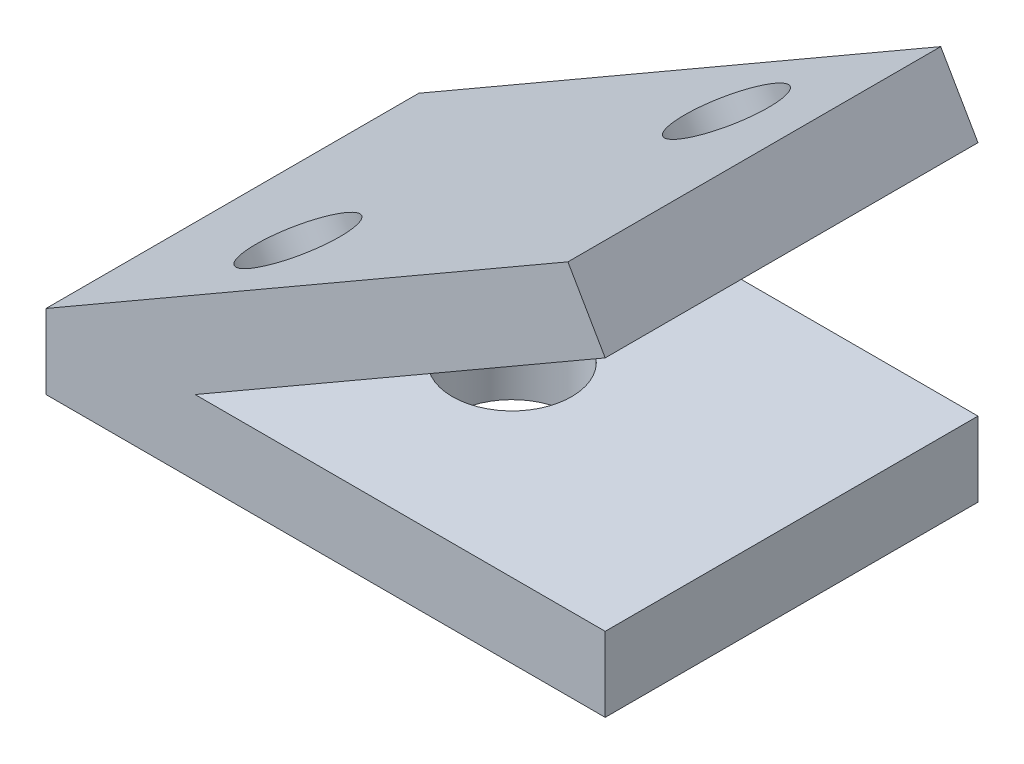
ISO-10303-21;
HEADER;
FILE_DESCRIPTION(('STEP AP214'),'2;1');
FILE_NAME('part.step','',(''),(''),'','','');
FILE_SCHEMA(('AUTOMOTIVE_DESIGN { 1 0 10303 214 1 1 1 1 }'));
ENDSEC;
DATA;
#1=APPLICATION_CONTEXT('core data for automotive mechanical design processes');
#2=APPLICATION_PROTOCOL_DEFINITION('international standard','automotive_design',2000,#1);
#3=PRODUCT_CONTEXT('',#1,'mechanical');
#4=PRODUCT('Part','Part','',(#3));
#5=PRODUCT_RELATED_PRODUCT_CATEGORY('part','',(#4));
#6=PRODUCT_DEFINITION_FORMATION('','',#4);
#7=PRODUCT_DEFINITION_CONTEXT('part definition',#1,'design');
#8=PRODUCT_DEFINITION('design','',#6,#7);
#9=PRODUCT_DEFINITION_SHAPE('','',#8);
#10=(LENGTH_UNIT() NAMED_UNIT(*) SI_UNIT(.MILLI.,.METRE.));
#11=(NAMED_UNIT(*) PLANE_ANGLE_UNIT() SI_UNIT($,.RADIAN.));
#12=(NAMED_UNIT(*) SI_UNIT($,.STERADIAN.) SOLID_ANGLE_UNIT());
#13=UNCERTAINTY_MEASURE_WITH_UNIT(LENGTH_MEASURE(1.E-05),#10,'distance_accuracy_value','');
#14=(GEOMETRIC_REPRESENTATION_CONTEXT(3) GLOBAL_UNCERTAINTY_ASSIGNED_CONTEXT((#13)) GLOBAL_UNIT_ASSIGNED_CONTEXT((#10,
#11,#12)) REPRESENTATION_CONTEXT('',''));
#15=CARTESIAN_POINT('',(0.,0.,0.));
#16=DIRECTION('',(0.,0.,1.));
#17=DIRECTION('',(1.,0.,0.));
#18=AXIS2_PLACEMENT_3D('',#15,#16,#17);
#19=CARTESIAN_POINT('',(0.,0.,10.));
#20=DIRECTION('',(1.,0.,0.));
#21=DIRECTION('',(0.,0.,-1.));
#22=AXIS2_PLACEMENT_3D('',#19,#20,#21);
#23=PLANE('',#22);
#24=DIRECTION('',(0.,-1.,0.));
#25=VECTOR('',#24,1.);
#26=CARTESIAN_POINT('',(0.,0.,0.));
#27=LINE('',#26,#25);
#28=CARTESIAN_POINT('',(0.,2.,0.));
#29=VERTEX_POINT('',#28);
#30=CARTESIAN_POINT('',(0.,0.,0.));
#31=VERTEX_POINT('',#30);
#32=EDGE_CURVE('E153',#29,#31,#27,.T.);
#33=ORIENTED_EDGE('',*,*,#32,.T.);
#34=DIRECTION('',(0.,0.,-1.));
#35=VECTOR('',#34,1.);
#36=CARTESIAN_POINT('',(0.,0.,10.));
#37=LINE('',#36,#35);
#38=CARTESIAN_POINT('',(0.,0.,10.));
#39=VERTEX_POINT('',#38);
#40=EDGE_CURVE('E11',#39,#31,#37,.T.);
#41=ORIENTED_EDGE('',*,*,#40,.F.);
#42=DIRECTION('',(0.,-1.,0.));
#43=VECTOR('',#42,1.);
#44=CARTESIAN_POINT('',(0.,0.,10.));
#45=LINE('',#44,#43);
#46=CARTESIAN_POINT('',(0.,2.,10.));
#47=VERTEX_POINT('',#46);
#48=EDGE_CURVE('E135',#47,#39,#45,.T.);
#49=ORIENTED_EDGE('',*,*,#48,.F.);
#50=DIRECTION('',(0.,0.,-1.));
#51=VECTOR('',#50,1.);
#52=CARTESIAN_POINT('',(0.,2.,10.));
#53=LINE('',#52,#51);
#54=EDGE_CURVE('E144',#47,#29,#53,.T.);
#55=ORIENTED_EDGE('',*,*,#54,.T.);
#56=EDGE_LOOP('',(#33,#41,#49,#55));
#57=FACE_BOUND('',#56,.T.);
#58=ADVANCED_FACE('F44',(#57),#23,.F.);
#59=CARTESIAN_POINT('',(0.,0.,10.));
#60=DIRECTION('',(0.,1.,0.));
#61=DIRECTION('',(0.,0.,1.));
#62=AXIS2_PLACEMENT_3D('',#59,#60,#61);
#63=PLANE('',#62);
#64=CARTESIAN_POINT('',(7.5,0.,5.));
#65=DIRECTION('',(0.,1.,0.));
#66=DIRECTION('',(0.,0.,1.));
#67=AXIS2_PLACEMENT_3D('',#64,#65,#66);
#68=CIRCLE('',#67,1.6);
#69=CARTESIAN_POINT('',(7.5,0.,6.6));
#70=VERTEX_POINT('',#69);
#71=EDGE_CURVE('E197',#70,#70,#68,.F.);
#72=ORIENTED_EDGE('',*,*,#71,.F.);
#73=EDGE_LOOP('',(#72));
#74=FACE_BOUND('',#73,.T.);
#75=DIRECTION('',(1.,0.,0.));
#76=VECTOR('',#75,1.);
#77=CARTESIAN_POINT('',(0.,0.,0.));
#78=LINE('',#77,#76);
#79=CARTESIAN_POINT('',(15.,0.,0.));
#80=VERTEX_POINT('',#79);
#81=EDGE_CURVE('E140',#31,#80,#78,.T.);
#82=ORIENTED_EDGE('',*,*,#81,.T.);
#83=DIRECTION('',(0.,0.,-1.));
#84=VECTOR('',#83,1.);
#85=CARTESIAN_POINT('',(15.,0.,10.));
#86=LINE('',#85,#84);
#87=CARTESIAN_POINT('',(15.,0.,10.));
#88=VERTEX_POINT('',#87);
#89=EDGE_CURVE('E52',#88,#80,#86,.T.);
#90=ORIENTED_EDGE('',*,*,#89,.F.);
#91=DIRECTION('',(1.,0.,0.));
#92=VECTOR('',#91,1.);
#93=CARTESIAN_POINT('',(0.,0.,10.));
#94=LINE('',#93,#92);
#95=EDGE_CURVE('E90',#39,#88,#94,.T.);
#96=ORIENTED_EDGE('',*,*,#95,.F.);
#97=ORIENTED_EDGE('',*,*,#40,.T.);
#98=EDGE_LOOP('',(#82,#90,#96,#97));
#99=FACE_BOUND('',#98,.T.);
#100=ADVANCED_FACE('F156',(#74,#99),#63,.F.);
#101=CARTESIAN_POINT('',(15.,0.,10.));
#102=DIRECTION('',(-1.,0.,0.));
#103=DIRECTION('',(0.,0.,1.));
#104=AXIS2_PLACEMENT_3D('',#101,#102,#103);
#105=PLANE('',#104);
#106=DIRECTION('',(0.,1.,0.));
#107=VECTOR('',#106,1.);
#108=CARTESIAN_POINT('',(15.,0.,0.));
#109=LINE('',#108,#107);
#110=CARTESIAN_POINT('',(15.,2.,0.));
#111=VERTEX_POINT('',#110);
#112=EDGE_CURVE('E85',#80,#111,#109,.T.);
#113=ORIENTED_EDGE('',*,*,#112,.T.);
#114=DIRECTION('',(0.,0.,-1.));
#115=VECTOR('',#114,1.);
#116=CARTESIAN_POINT('',(15.,2.,10.));
#117=LINE('',#116,#115);
#118=CARTESIAN_POINT('',(15.,2.,10.));
#119=VERTEX_POINT('',#118);
#120=EDGE_CURVE('E133',#119,#111,#117,.T.);
#121=ORIENTED_EDGE('',*,*,#120,.F.);
#122=DIRECTION('',(0.,1.,0.));
#123=VECTOR('',#122,1.);
#124=CARTESIAN_POINT('',(15.,0.,10.));
#125=LINE('',#124,#123);
#126=EDGE_CURVE('E68',#88,#119,#125,.T.);
#127=ORIENTED_EDGE('',*,*,#126,.F.);
#128=ORIENTED_EDGE('',*,*,#89,.T.);
#129=EDGE_LOOP('',(#113,#121,#127,#128));
#130=FACE_BOUND('',#129,.T.);
#131=ADVANCED_FACE('F151',(#130),#105,.F.);
#132=CARTESIAN_POINT('',(0.,2.,10.));
#133=DIRECTION('',(0.,-1.,0.));
#134=DIRECTION('',(0.,0.,-1.));
#135=AXIS2_PLACEMENT_3D('',#132,#133,#134);
#136=PLANE('',#135);
#137=CARTESIAN_POINT('',(7.5,2.,5.));
#138=DIRECTION('',(0.,1.,0.));
#139=DIRECTION('',(0.,0.,1.));
#140=AXIS2_PLACEMENT_3D('',#137,#138,#139);
#141=CIRCLE('',#140,1.6);
#142=CARTESIAN_POINT('',(7.5,2.,6.6));
#143=VERTEX_POINT('',#142);
#144=EDGE_CURVE('E207',#143,#143,#141,.T.);
#145=ORIENTED_EDGE('',*,*,#144,.F.);
#146=EDGE_LOOP('',(#145));
#147=FACE_BOUND('',#146,.T.);
#148=DIRECTION('',(-1.,0.,0.));
#149=VECTOR('',#148,1.);
#150=CARTESIAN_POINT('',(0.,2.,0.));
#151=LINE('',#150,#149);
#152=CARTESIAN_POINT('',(3.99999999999998,2.,0.));
#153=VERTEX_POINT('',#152);
#154=EDGE_CURVE('E118',#111,#153,#151,.T.);
#155=ORIENTED_EDGE('',*,*,#154,.T.);
#156=DIRECTION('',(0.,0.,1.));
#157=VECTOR('',#156,1.);
#158=CARTESIAN_POINT('',(3.99999999999998,2.,-17.0391705588428));
#159=LINE('',#158,#157);
#160=CARTESIAN_POINT('',(3.99999999999998,2.,10.));
#161=VERTEX_POINT('',#160);
#162=EDGE_CURVE('E124',#153,#161,#159,.T.);
#163=ORIENTED_EDGE('',*,*,#162,.T.);
#164=DIRECTION('',(-1.,0.,0.));
#165=VECTOR('',#164,1.);
#166=CARTESIAN_POINT('',(0.,2.,10.));
#167=LINE('',#166,#165);
#168=EDGE_CURVE('E148',#119,#161,#167,.T.);
#169=ORIENTED_EDGE('',*,*,#168,.F.);
#170=ORIENTED_EDGE('',*,*,#120,.T.);
#171=EDGE_LOOP('',(#155,#163,#169,#170));
#172=FACE_BOUND('',#171,.T.);
#173=ADVANCED_FACE('F132',(#147,#172),#136,.F.);
#174=CARTESIAN_POINT('',(0.,0.,10.));
#175=DIRECTION('',(0.,0.,-1.));
#176=DIRECTION('',(-1.,0.,0.));
#177=AXIS2_PLACEMENT_3D('',#174,#175,#176);
#178=PLANE('',#177);
#179=ORIENTED_EDGE('',*,*,#48,.T.);
#180=ORIENTED_EDGE('',*,*,#95,.T.);
#181=ORIENTED_EDGE('',*,*,#126,.T.);
#182=ORIENTED_EDGE('',*,*,#168,.T.);
#183=DIRECTION('',(0.866025403784438,0.500000000000001,0.));
#184=VECTOR('',#183,1.);
#185=CARTESIAN_POINT('',(3.99999999999998,2.,10.));
#186=LINE('',#185,#184);
#187=CARTESIAN_POINT('',(15.,8.35085296108592,10.));
#188=VERTEX_POINT('',#187);
#189=EDGE_CURVE('E59',#161,#188,#186,.T.);
#190=ORIENTED_EDGE('',*,*,#189,.T.);
#191=DIRECTION('',(-0.500000000000001,0.866025403784438,0.));
#192=VECTOR('',#191,1.);
#193=CARTESIAN_POINT('',(15.,8.35085296108592,10.));
#194=LINE('',#193,#192);
#195=CARTESIAN_POINT('',(14.,10.0829037686548,10.));
#196=VERTEX_POINT('',#195);
#197=EDGE_CURVE('E130',#188,#196,#194,.T.);
#198=ORIENTED_EDGE('',*,*,#197,.T.);
#199=DIRECTION('',(-0.866025403784438,-0.500000000000002,0.));
#200=VECTOR('',#199,1.);
#201=CARTESIAN_POINT('',(14.,10.0829037686548,10.));
#202=LINE('',#201,#200);
#203=EDGE_CURVE('E178',#196,#47,#202,.T.);
#204=ORIENTED_EDGE('',*,*,#203,.T.);
#205=EDGE_LOOP('',(#179,#180,#181,#182,#190,#198,#204));
#206=FACE_BOUND('',#205,.T.);
#207=ADVANCED_FACE('F215',(#206),#178,.F.);
#208=CARTESIAN_POINT('',(0.,0.,0.));
#209=DIRECTION('',(0.,0.,-1.));
#210=DIRECTION('',(-1.,0.,0.));
#211=AXIS2_PLACEMENT_3D('',#208,#209,#210);
#212=PLANE('',#211);
#213=ORIENTED_EDGE('',*,*,#32,.F.);
#214=DIRECTION('',(-0.866025403784438,-0.500000000000002,0.));
#215=VECTOR('',#214,1.);
#216=CARTESIAN_POINT('',(14.,10.0829037686548,0.));
#217=LINE('',#216,#215);
#218=CARTESIAN_POINT('',(14.,10.0829037686548,0.));
#219=VERTEX_POINT('',#218);
#220=EDGE_CURVE('E160',#219,#29,#217,.T.);
#221=ORIENTED_EDGE('',*,*,#220,.F.);
#222=DIRECTION('',(-0.500000000000001,0.866025403784438,0.));
#223=VECTOR('',#222,1.);
#224=CARTESIAN_POINT('',(15.,8.35085296108592,0.));
#225=LINE('',#224,#223);
#226=CARTESIAN_POINT('',(15.,8.35085296108592,0.));
#227=VERTEX_POINT('',#226);
#228=EDGE_CURVE('E120',#227,#219,#225,.T.);
#229=ORIENTED_EDGE('',*,*,#228,.F.);
#230=DIRECTION('',(0.866025403784438,0.500000000000001,0.));
#231=VECTOR('',#230,1.);
#232=CARTESIAN_POINT('',(3.99999999999998,2.,0.));
#233=LINE('',#232,#231);
#234=EDGE_CURVE('E114',#153,#227,#233,.T.);
#235=ORIENTED_EDGE('',*,*,#234,.F.);
#236=ORIENTED_EDGE('',*,*,#154,.F.);
#237=ORIENTED_EDGE('',*,*,#112,.F.);
#238=ORIENTED_EDGE('',*,*,#81,.F.);
#239=EDGE_LOOP('',(#213,#221,#229,#235,#236,#237,#238));
#240=FACE_BOUND('',#239,.T.);
#241=ADVANCED_FACE('F116',(#240),#212,.T.);
#242=CARTESIAN_POINT('',(3.99999999999998,2.,-17.0391705588428));
#243=DIRECTION('',(0.500000000000001,-0.866025403784438,0.));
#244=DIRECTION('',(0.866025403784438,0.500000000000001,0.));
#245=AXIS2_PLACEMENT_3D('',#242,#243,#244);
#246=PLANE('',#245);
#247=CARTESIAN_POINT('',(5.25721420742495,2.72585296108583,7.50000000000001));
#248=DIRECTION('',(0.500000000000001,-0.866025403784438,0.));
#249=DIRECTION('',(0.866025403784438,0.500000000000001,0.));
#250=AXIS2_PLACEMENT_3D('',#247,#248,#249);
#251=CIRCLE('',#250,1.3);
#252=CARTESIAN_POINT('',(6.38304723234472,3.37585296108583,7.50000000000001));
#253=VERTEX_POINT('',#252);
#254=EDGE_CURVE('E182',#253,#253,#251,.F.);
#255=ORIENTED_EDGE('',*,*,#254,.T.);
#256=EDGE_LOOP('',(#255));
#257=FACE_BOUND('',#256,.T.);
#258=CARTESIAN_POINT('',(11.7524047358085,6.47585296108599,2.5));
#259=DIRECTION('',(0.500000000000001,-0.866025403784438,0.));
#260=DIRECTION('',(0.866025403784438,0.500000000000001,0.));
#261=AXIS2_PLACEMENT_3D('',#258,#259,#260);
#262=CIRCLE('',#261,1.3);
#263=CARTESIAN_POINT('',(12.8782377607283,7.12585296108599,2.5));
#264=VERTEX_POINT('',#263);
#265=EDGE_CURVE('E193',#264,#264,#262,.F.);
#266=ORIENTED_EDGE('',*,*,#265,.T.);
#267=EDGE_LOOP('',(#266));
#268=FACE_BOUND('',#267,.T.);
#269=ORIENTED_EDGE('',*,*,#162,.F.);
#270=ORIENTED_EDGE('',*,*,#234,.T.);
#271=DIRECTION('',(0.,0.,1.));
#272=VECTOR('',#271,1.);
#273=CARTESIAN_POINT('',(15.,8.35085296108592,-17.0391705588428));
#274=LINE('',#273,#272);
#275=EDGE_CURVE('E123',#227,#188,#274,.T.);
#276=ORIENTED_EDGE('',*,*,#275,.T.);
#277=ORIENTED_EDGE('',*,*,#189,.F.);
#278=EDGE_LOOP('',(#269,#270,#276,#277));
#279=FACE_BOUND('',#278,.T.);
#280=ADVANCED_FACE('F126',(#257,#268,#279),#246,.T.);
#281=CARTESIAN_POINT('',(15.,8.35085296108592,-17.0391705588428));
#282=DIRECTION('',(0.866025403784438,0.500000000000001,0.));
#283=DIRECTION('',(-0.500000000000001,0.866025403784438,0.));
#284=AXIS2_PLACEMENT_3D('',#281,#282,#283);
#285=PLANE('',#284);
#286=ORIENTED_EDGE('',*,*,#275,.F.);
#287=ORIENTED_EDGE('',*,*,#228,.T.);
#288=DIRECTION('',(0.,0.,1.));
#289=VECTOR('',#288,1.);
#290=CARTESIAN_POINT('',(14.,10.0829037686548,-17.0391705588428));
#291=LINE('',#290,#289);
#292=EDGE_CURVE('E163',#219,#196,#291,.T.);
#293=ORIENTED_EDGE('',*,*,#292,.T.);
#294=ORIENTED_EDGE('',*,*,#197,.F.);
#295=EDGE_LOOP('',(#286,#287,#293,#294));
#296=FACE_BOUND('',#295,.T.);
#297=ADVANCED_FACE('F249',(#296),#285,.T.);
#298=CARTESIAN_POINT('',(14.,10.0829037686548,-17.0391705588428));
#299=DIRECTION('',(-0.500000000000002,0.866025403784438,0.));
#300=DIRECTION('',(-0.866025403784438,-0.500000000000002,0.));
#301=AXIS2_PLACEMENT_3D('',#298,#299,#300);
#302=PLANE('',#301);
#303=CARTESIAN_POINT('',(4.25721420742495,4.4579037686547,7.50000000000001));
#304=DIRECTION('',(-0.500000000000002,0.866025403784438,0.));
#305=DIRECTION('',(-0.866025403784438,-0.500000000000002,0.));
#306=AXIS2_PLACEMENT_3D('',#303,#304,#305);
#307=CIRCLE('',#306,1.3);
#308=CARTESIAN_POINT('',(3.13138118250518,3.8079037686547,7.50000000000001));
#309=VERTEX_POINT('',#308);
#310=EDGE_CURVE('E192',#309,#309,#307,.T.);
#311=ORIENTED_EDGE('',*,*,#310,.F.);
#312=EDGE_LOOP('',(#311));
#313=FACE_BOUND('',#312,.T.);
#314=CARTESIAN_POINT('',(10.7524047358085,8.20790376865486,2.5));
#315=DIRECTION('',(-0.500000000000002,0.866025403784438,0.));
#316=DIRECTION('',(-0.866025403784438,-0.500000000000002,0.));
#317=AXIS2_PLACEMENT_3D('',#314,#315,#316);
#318=CIRCLE('',#317,1.3);
#319=CARTESIAN_POINT('',(9.62657171088872,7.55790376865486,2.5));
#320=VERTEX_POINT('',#319);
#321=EDGE_CURVE('E188',#320,#320,#318,.T.);
#322=ORIENTED_EDGE('',*,*,#321,.F.);
#323=EDGE_LOOP('',(#322));
#324=FACE_BOUND('',#323,.T.);
#325=ORIENTED_EDGE('',*,*,#292,.F.);
#326=ORIENTED_EDGE('',*,*,#220,.T.);
#327=ORIENTED_EDGE('',*,*,#54,.F.);
#328=ORIENTED_EDGE('',*,*,#203,.F.);
#329=EDGE_LOOP('',(#325,#326,#327,#328));
#330=FACE_BOUND('',#329,.T.);
#331=ADVANCED_FACE('F245',(#313,#324,#330),#302,.T.);
#332=CARTESIAN_POINT('',(13.5908823668935,3.29151629546786,2.5));
#333=DIRECTION('',(-0.500000000000002,0.866025403784438,0.));
#334=DIRECTION('',(-0.866025403784438,-0.500000000000002,0.));
#335=AXIS2_PLACEMENT_3D('',#332,#333,#334);
#336=CYLINDRICAL_SURFACE('',#335,1.3);
#337=ORIENTED_EDGE('',*,*,#321,.T.);
#338=EDGE_LOOP('',(#337));
#339=FACE_BOUND('',#338,.T.);
#340=ORIENTED_EDGE('',*,*,#265,.F.);
#341=EDGE_LOOP('',(#340));
#342=FACE_BOUND('',#341,.T.);
#343=ADVANCED_FACE('F239',(#339,#342),#336,.F.);
#344=CARTESIAN_POINT('',(7.09569183850998,-0.458483704532299,7.50000000000001));
#345=DIRECTION('',(-0.500000000000002,0.866025403784438,0.));
#346=DIRECTION('',(-0.866025403784438,-0.500000000000002,0.));
#347=AXIS2_PLACEMENT_3D('',#344,#345,#346);
#348=CYLINDRICAL_SURFACE('',#347,1.3);
#349=ORIENTED_EDGE('',*,*,#310,.T.);
#350=EDGE_LOOP('',(#349));
#351=FACE_BOUND('',#350,.T.);
#352=ORIENTED_EDGE('',*,*,#254,.F.);
#353=EDGE_LOOP('',(#352));
#354=FACE_BOUND('',#353,.T.);
#355=ADVANCED_FACE('F235',(#351,#354),#348,.F.);
#356=CARTESIAN_POINT('',(7.5,-4.5254833995939,5.));
#357=DIRECTION('',(0.,1.,0.));
#358=DIRECTION('',(0.,0.,1.));
#359=AXIS2_PLACEMENT_3D('',#356,#357,#358);
#360=CYLINDRICAL_SURFACE('',#359,1.6);
#361=ORIENTED_EDGE('',*,*,#71,.T.);
#362=EDGE_LOOP('',(#361));
#363=FACE_BOUND('',#362,.T.);
#364=ORIENTED_EDGE('',*,*,#144,.T.);
#365=EDGE_LOOP('',(#364));
#366=FACE_BOUND('',#365,.T.);
#367=ADVANCED_FACE('F212',(#363,#366),#360,.F.);
#368=CLOSED_SHELL('',(#58,#100,#131,#173,#207,#241,#280,#297,#331,#343,#355,#367));
#369=MANIFOLD_SOLID_BREP('B2',#368);
#370=ADVANCED_BREP_SHAPE_REPRESENTATION('',(#18,#369),#14);
#371=SHAPE_DEFINITION_REPRESENTATION(#9,#370);
ENDSEC;
END-ISO-10303-21;
